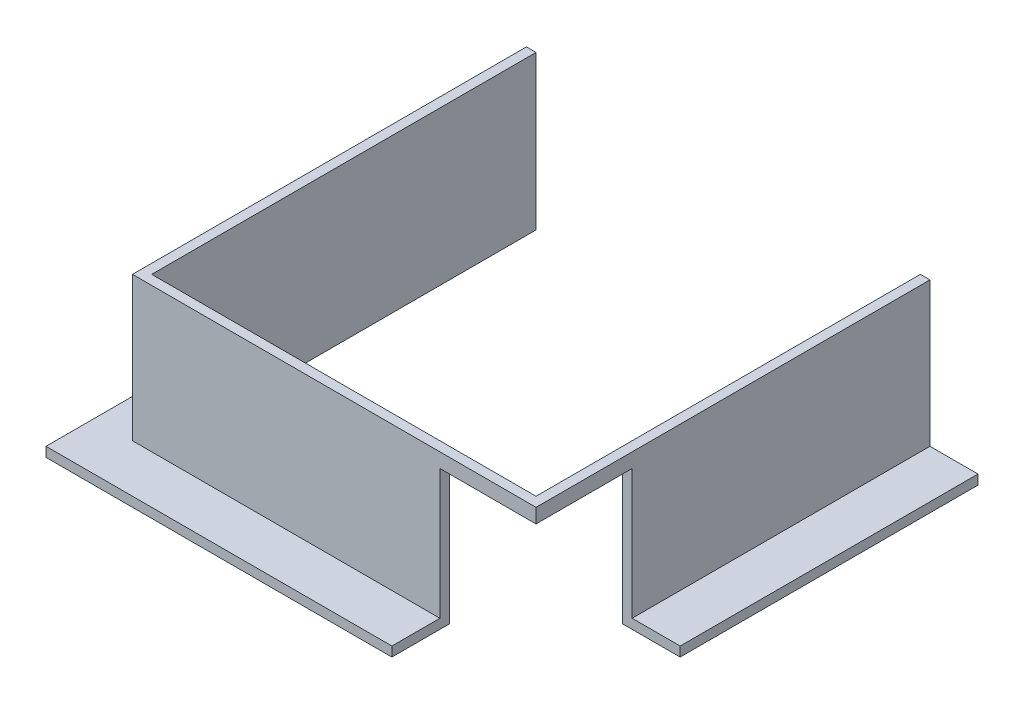
ISO-10303-21;
HEADER;
FILE_DESCRIPTION(('STEP AP214'),'2;1');
FILE_NAME('part.step','',(''),(''),'','','');
FILE_SCHEMA(('AUTOMOTIVE_DESIGN { 1 0 10303 214 1 1 1 1 }'));
ENDSEC;
DATA;
#1=APPLICATION_CONTEXT('core data for automotive mechanical design processes');
#2=APPLICATION_PROTOCOL_DEFINITION('international standard','automotive_design',2000,#1);
#3=PRODUCT_CONTEXT('',#1,'mechanical');
#4=PRODUCT('Part','Part','',(#3));
#5=PRODUCT_RELATED_PRODUCT_CATEGORY('part','',(#4));
#6=PRODUCT_DEFINITION_FORMATION('','',#4);
#7=PRODUCT_DEFINITION_CONTEXT('part definition',#1,'design');
#8=PRODUCT_DEFINITION('design','',#6,#7);
#9=PRODUCT_DEFINITION_SHAPE('','',#8);
#10=(LENGTH_UNIT() NAMED_UNIT(*) SI_UNIT(.MILLI.,.METRE.));
#11=(NAMED_UNIT(*) PLANE_ANGLE_UNIT() SI_UNIT($,.RADIAN.));
#12=(NAMED_UNIT(*) SI_UNIT($,.STERADIAN.) SOLID_ANGLE_UNIT());
#13=UNCERTAINTY_MEASURE_WITH_UNIT(LENGTH_MEASURE(1.E-05),#10,'distance_accuracy_value','');
#14=(GEOMETRIC_REPRESENTATION_CONTEXT(3) GLOBAL_UNCERTAINTY_ASSIGNED_CONTEXT((#13)) GLOBAL_UNIT_ASSIGNED_CONTEXT((#10,
#11,#12)) REPRESENTATION_CONTEXT('',''));
#15=CARTESIAN_POINT('',(0.,0.,0.));
#16=DIRECTION('',(0.,0.,1.));
#17=DIRECTION('',(1.,0.,0.));
#18=AXIS2_PLACEMENT_3D('',#15,#16,#17);
#19=CARTESIAN_POINT('',(0.,0.,0.));
#20=DIRECTION('',(0.,1.,0.));
#21=DIRECTION('',(0.,0.,1.));
#22=AXIS2_PLACEMENT_3D('',#19,#20,#21);
#23=PLANE('',#22);
#24=DIRECTION('',(1.,0.,0.));
#25=VECTOR('',#24,1.);
#26=CARTESIAN_POINT('',(62.,0.,-18.));
#27=LINE('',#26,#25);
#28=CARTESIAN_POINT('',(82.,0.,-18.));
#29=VERTEX_POINT('',#28);
#30=CARTESIAN_POINT('',(92.,0.,-18.));
#31=VERTEX_POINT('',#30);
#32=EDGE_CURVE('E189',#29,#31,#27,.T.);
#33=ORIENTED_EDGE('',*,*,#32,.T.);
#34=DIRECTION('',(0.,0.,1.));
#35=VECTOR('',#34,1.);
#36=CARTESIAN_POINT('',(92.,0.,1.99999999999999));
#37=LINE('',#36,#35);
#38=CARTESIAN_POINT('',(92.,0.,-80.));
#39=VERTEX_POINT('',#38);
#40=EDGE_CURVE('E217',#39,#31,#37,.T.);
#41=ORIENTED_EDGE('',*,*,#40,.F.);
#42=DIRECTION('',(1.,0.,0.));
#43=VECTOR('',#42,1.);
#44=CARTESIAN_POINT('',(92.,0.,-80.));
#45=LINE('',#44,#43);
#46=CARTESIAN_POINT('',(82.,0.,-80.));
#47=VERTEX_POINT('',#46);
#48=EDGE_CURVE('E193',#47,#39,#45,.T.);
#49=ORIENTED_EDGE('',*,*,#48,.F.);
#50=DIRECTION('',(0.,0.,-1.));
#51=VECTOR('',#50,1.);
#52=CARTESIAN_POINT('',(82.,0.,1.99999999999999));
#53=LINE('',#52,#51);
#54=EDGE_CURVE('E242',#29,#47,#53,.T.);
#55=ORIENTED_EDGE('',*,*,#54,.F.);
#56=EDGE_LOOP('',(#33,#41,#49,#55));
#57=FACE_BOUND('',#56,.T.);
#58=ADVANCED_FACE('F33',(#57),#23,.T.);
#59=CARTESIAN_POINT('',(0.,-2.,0.));
#60=DIRECTION('',(0.,1.,0.));
#61=DIRECTION('',(0.,0.,1.));
#62=AXIS2_PLACEMENT_3D('',#59,#60,#61);
#63=PLANE('',#62);
#64=DIRECTION('',(0.,0.,1.));
#65=VECTOR('',#64,1.);
#66=CARTESIAN_POINT('',(92.,-2.,1.99999999999999));
#67=LINE('',#66,#65);
#68=CARTESIAN_POINT('',(92.,-2.,-80.));
#69=VERTEX_POINT('',#68);
#70=CARTESIAN_POINT('',(92.,-2.,-18.));
#71=VERTEX_POINT('',#70);
#72=EDGE_CURVE('E205',#69,#71,#67,.T.);
#73=ORIENTED_EDGE('',*,*,#72,.T.);
#74=DIRECTION('',(-1.,0.,0.));
#75=VECTOR('',#74,1.);
#76=CARTESIAN_POINT('',(0.,-2.,-18.));
#77=LINE('',#76,#75);
#78=CARTESIAN_POINT('',(80.,-2.,-18.));
#79=VERTEX_POINT('',#78);
#80=EDGE_CURVE('E41',#71,#79,#77,.T.);
#81=ORIENTED_EDGE('',*,*,#80,.T.);
#82=DIRECTION('',(0.,0.,-1.));
#83=VECTOR('',#82,1.);
#84=CARTESIAN_POINT('',(80.,-2.,-80.));
#85=LINE('',#84,#83);
#86=CARTESIAN_POINT('',(80.,-2.,-80.));
#87=VERTEX_POINT('',#86);
#88=EDGE_CURVE('E201',#79,#87,#85,.T.);
#89=ORIENTED_EDGE('',*,*,#88,.T.);
#90=DIRECTION('',(1.,0.,0.));
#91=VECTOR('',#90,1.);
#92=CARTESIAN_POINT('',(92.,-2.,-80.));
#93=LINE('',#92,#91);
#94=EDGE_CURVE('E203',#87,#69,#93,.T.);
#95=ORIENTED_EDGE('',*,*,#94,.T.);
#96=EDGE_LOOP('',(#73,#81,#89,#95));
#97=FACE_BOUND('',#96,.T.);
#98=ADVANCED_FACE('F281',(#97),#63,.F.);
#99=CARTESIAN_POINT('',(0.,30.,0.));
#100=DIRECTION('',(-1.,0.,0.));
#101=DIRECTION('',(0.,0.,1.));
#102=AXIS2_PLACEMENT_3D('',#99,#100,#101);
#103=PLANE('',#102);
#104=DIRECTION('',(0.,-1.,0.));
#105=VECTOR('',#104,1.);
#106=CARTESIAN_POINT('',(0.,30.,0.));
#107=LINE('',#106,#105);
#108=CARTESIAN_POINT('',(0.,30.,0.));
#109=VERTEX_POINT('',#108);
#110=CARTESIAN_POINT('',(0.,-2.,0.));
#111=VERTEX_POINT('',#110);
#112=EDGE_CURVE('E256',#109,#111,#107,.T.);
#113=ORIENTED_EDGE('',*,*,#112,.T.);
#114=DIRECTION('',(0.,0.,1.));
#115=VECTOR('',#114,1.);
#116=CARTESIAN_POINT('',(0.,-2.,0.));
#117=LINE('',#116,#115);
#118=CARTESIAN_POINT('',(0.,-2.,-80.));
#119=VERTEX_POINT('',#118);
#120=EDGE_CURVE('E194',#119,#111,#117,.T.);
#121=ORIENTED_EDGE('',*,*,#120,.F.);
#122=DIRECTION('',(0.,-1.,0.));
#123=VECTOR('',#122,1.);
#124=CARTESIAN_POINT('',(0.,30.,-80.));
#125=LINE('',#124,#123);
#126=CARTESIAN_POINT('',(0.,30.,-80.));
#127=VERTEX_POINT('',#126);
#128=EDGE_CURVE('E278',#127,#119,#125,.T.);
#129=ORIENTED_EDGE('',*,*,#128,.F.);
#130=DIRECTION('',(0.,0.,-1.));
#131=VECTOR('',#130,1.);
#132=CARTESIAN_POINT('',(0.,30.,0.));
#133=LINE('',#132,#131);
#134=EDGE_CURVE('E238',#109,#127,#133,.T.);
#135=ORIENTED_EDGE('',*,*,#134,.F.);
#136=EDGE_LOOP('',(#113,#121,#129,#135));
#137=FACE_BOUND('',#136,.T.);
#138=ADVANCED_FACE('F35',(#137),#103,.F.);
#139=CARTESIAN_POINT('',(0.,30.,-80.));
#140=DIRECTION('',(0.,0.,1.));
#141=DIRECTION('',(1.,0.,0.));
#142=AXIS2_PLACEMENT_3D('',#139,#140,#141);
#143=PLANE('',#142);
#144=ORIENTED_EDGE('',*,*,#128,.T.);
#145=DIRECTION('',(1.,0.,0.));
#146=VECTOR('',#145,1.);
#147=CARTESIAN_POINT('',(0.,-2.,-80.));
#148=LINE('',#147,#146);
#149=CARTESIAN_POINT('',(-10.,-2.,-80.));
#150=VERTEX_POINT('',#149);
#151=EDGE_CURVE('E212',#150,#119,#148,.T.);
#152=ORIENTED_EDGE('',*,*,#151,.F.);
#153=DIRECTION('',(0.,1.,0.));
#154=VECTOR('',#153,1.);
#155=CARTESIAN_POINT('',(-10.,-2.,-80.));
#156=LINE('',#155,#154);
#157=CARTESIAN_POINT('',(-10.,0.,-80.));
#158=VERTEX_POINT('',#157);
#159=EDGE_CURVE('E215',#150,#158,#156,.T.);
#160=ORIENTED_EDGE('',*,*,#159,.T.);
#161=DIRECTION('',(1.,0.,0.));
#162=VECTOR('',#161,1.);
#163=CARTESIAN_POINT('',(0.,0.,-80.));
#164=LINE('',#163,#162);
#165=CARTESIAN_POINT('',(-2.,0.,-80.));
#166=VERTEX_POINT('',#165);
#167=EDGE_CURVE('E198',#158,#166,#164,.T.);
#168=ORIENTED_EDGE('',*,*,#167,.T.);
#169=DIRECTION('',(0.,-1.,0.));
#170=VECTOR('',#169,1.);
#171=CARTESIAN_POINT('',(-2.,30.,-80.));
#172=LINE('',#171,#170);
#173=CARTESIAN_POINT('',(-2.,30.,-80.));
#174=VERTEX_POINT('',#173);
#175=EDGE_CURVE('E275',#174,#166,#172,.T.);
#176=ORIENTED_EDGE('',*,*,#175,.F.);
#177=DIRECTION('',(-1.,0.,0.));
#178=VECTOR('',#177,1.);
#179=CARTESIAN_POINT('',(0.,30.,-80.));
#180=LINE('',#179,#178);
#181=EDGE_CURVE('E241',#127,#174,#180,.T.);
#182=ORIENTED_EDGE('',*,*,#181,.F.);
#183=EDGE_LOOP('',(#144,#152,#160,#168,#176,#182));
#184=FACE_BOUND('',#183,.T.);
#185=ADVANCED_FACE('F320',(#184),#143,.F.);
#186=CARTESIAN_POINT('',(-2.,30.,-80.));
#187=DIRECTION('',(1.,0.,0.));
#188=DIRECTION('',(0.,0.,-1.));
#189=AXIS2_PLACEMENT_3D('',#186,#187,#188);
#190=PLANE('',#189);
#191=DIRECTION('',(0.,0.,1.));
#192=VECTOR('',#191,1.);
#193=CARTESIAN_POINT('',(-2.,0.,-80.));
#194=LINE('',#193,#192);
#195=CARTESIAN_POINT('',(-2.,0.,2.));
#196=VERTEX_POINT('',#195);
#197=EDGE_CURVE('E237',#166,#196,#194,.T.);
#198=ORIENTED_EDGE('',*,*,#197,.T.);
#199=DIRECTION('',(0.,-1.,0.));
#200=VECTOR('',#199,1.);
#201=CARTESIAN_POINT('',(-2.,30.,2.));
#202=LINE('',#201,#200);
#203=CARTESIAN_POINT('',(-2.,30.,2.));
#204=VERTEX_POINT('',#203);
#205=EDGE_CURVE('E273',#204,#196,#202,.T.);
#206=ORIENTED_EDGE('',*,*,#205,.F.);
#207=DIRECTION('',(0.,0.,1.));
#208=VECTOR('',#207,1.);
#209=CARTESIAN_POINT('',(-2.,30.,-80.));
#210=LINE('',#209,#208);
#211=EDGE_CURVE('E244',#174,#204,#210,.T.);
#212=ORIENTED_EDGE('',*,*,#211,.F.);
#213=ORIENTED_EDGE('',*,*,#175,.T.);
#214=EDGE_LOOP('',(#198,#206,#212,#213));
#215=FACE_BOUND('',#214,.T.);
#216=ADVANCED_FACE('F313',(#215),#190,.F.);
#217=CARTESIAN_POINT('',(80.,30.,2.));
#218=DIRECTION('',(0.,0.,-1.));
#219=DIRECTION('',(-1.,0.,0.));
#220=AXIS2_PLACEMENT_3D('',#217,#218,#219);
#221=PLANE('',#220);
#222=DIRECTION('',(0.,-1.,0.));
#223=VECTOR('',#222,1.);
#224=CARTESIAN_POINT('',(62.,0.,1.99999999999999));
#225=LINE('',#224,#223);
#226=CARTESIAN_POINT('',(62.,27.,1.99999999999999));
#227=VERTEX_POINT('',#226);
#228=CARTESIAN_POINT('',(62.,0.,2.00000000000004));
#229=VERTEX_POINT('',#228);
#230=EDGE_CURVE('E154',#227,#229,#225,.T.);
#231=ORIENTED_EDGE('',*,*,#230,.F.);
#232=DIRECTION('',(1.,0.,0.));
#233=VECTOR('',#232,1.);
#234=CARTESIAN_POINT('',(62.,27.,1.99999999999999));
#235=LINE('',#234,#233);
#236=CARTESIAN_POINT('',(82.,27.,1.99999999999999));
#237=VERTEX_POINT('',#236);
#238=EDGE_CURVE('E159',#227,#237,#235,.T.);
#239=ORIENTED_EDGE('',*,*,#238,.T.);
#240=DIRECTION('',(0.,-1.,0.));
#241=VECTOR('',#240,1.);
#242=CARTESIAN_POINT('',(82.,30.,1.99999999999999));
#243=LINE('',#242,#241);
#244=CARTESIAN_POINT('',(82.,30.,1.99999999999999));
#245=VERTEX_POINT('',#244);
#246=EDGE_CURVE('E271',#245,#237,#243,.T.);
#247=ORIENTED_EDGE('',*,*,#246,.F.);
#248=DIRECTION('',(1.,0.,0.));
#249=VECTOR('',#248,1.);
#250=CARTESIAN_POINT('',(80.,30.,2.));
#251=LINE('',#250,#249);
#252=EDGE_CURVE('E246',#204,#245,#251,.T.);
#253=ORIENTED_EDGE('',*,*,#252,.F.);
#254=ORIENTED_EDGE('',*,*,#205,.T.);
#255=DIRECTION('',(1.,0.,0.));
#256=VECTOR('',#255,1.);
#257=CARTESIAN_POINT('',(80.,0.,2.));
#258=LINE('',#257,#256);
#259=EDGE_CURVE('E162',#196,#229,#258,.T.);
#260=ORIENTED_EDGE('',*,*,#259,.T.);
#261=EDGE_LOOP('',(#231,#239,#247,#253,#254,#260));
#262=FACE_BOUND('',#261,.T.);
#263=ADVANCED_FACE('F156',(#262),#221,.F.);
#264=CARTESIAN_POINT('',(82.,30.,1.99999999999999));
#265=DIRECTION('',(-1.,0.,0.));
#266=DIRECTION('',(0.,0.,1.));
#267=AXIS2_PLACEMENT_3D('',#264,#265,#266);
#268=PLANE('',#267);
#269=ORIENTED_EDGE('',*,*,#246,.T.);
#270=DIRECTION('',(0.,0.,1.));
#271=VECTOR('',#270,1.);
#272=CARTESIAN_POINT('',(82.,27.,-18.));
#273=LINE('',#272,#271);
#274=CARTESIAN_POINT('',(82.,27.,-18.));
#275=VERTEX_POINT('',#274);
#276=EDGE_CURVE('E171',#275,#237,#273,.T.);
#277=ORIENTED_EDGE('',*,*,#276,.F.);
#278=DIRECTION('',(0.,1.,0.));
#279=VECTOR('',#278,1.);
#280=CARTESIAN_POINT('',(82.,20.,-18.));
#281=LINE('',#280,#279);
#282=EDGE_CURVE('E164',#29,#275,#281,.T.);
#283=ORIENTED_EDGE('',*,*,#282,.F.);
#284=ORIENTED_EDGE('',*,*,#54,.T.);
#285=DIRECTION('',(0.,-1.,0.));
#286=VECTOR('',#285,1.);
#287=CARTESIAN_POINT('',(82.,30.,-80.));
#288=LINE('',#287,#286);
#289=CARTESIAN_POINT('',(82.,30.,-80.));
#290=VERTEX_POINT('',#289);
#291=EDGE_CURVE('E268',#290,#47,#288,.T.);
#292=ORIENTED_EDGE('',*,*,#291,.F.);
#293=DIRECTION('',(0.,0.,-1.));
#294=VECTOR('',#293,1.);
#295=CARTESIAN_POINT('',(82.,30.,1.99999999999999));
#296=LINE('',#295,#294);
#297=EDGE_CURVE('E248',#245,#290,#296,.T.);
#298=ORIENTED_EDGE('',*,*,#297,.F.);
#299=EDGE_LOOP('',(#269,#277,#283,#284,#292,#298));
#300=FACE_BOUND('',#299,.T.);
#301=ADVANCED_FACE('F305',(#300),#268,.F.);
#302=CARTESIAN_POINT('',(82.,30.,-80.));
#303=DIRECTION('',(0.,0.,1.));
#304=DIRECTION('',(1.,0.,0.));
#305=AXIS2_PLACEMENT_3D('',#302,#303,#304);
#306=PLANE('',#305);
#307=ORIENTED_EDGE('',*,*,#291,.T.);
#308=ORIENTED_EDGE('',*,*,#48,.T.);
#309=DIRECTION('',(0.,1.,0.));
#310=VECTOR('',#309,1.);
#311=CARTESIAN_POINT('',(92.,-2.,-80.));
#312=LINE('',#311,#310);
#313=EDGE_CURVE('E231',#69,#39,#312,.T.);
#314=ORIENTED_EDGE('',*,*,#313,.F.);
#315=ORIENTED_EDGE('',*,*,#94,.F.);
#316=DIRECTION('',(0.,-1.,0.));
#317=VECTOR('',#316,1.);
#318=CARTESIAN_POINT('',(80.,30.,-80.));
#319=LINE('',#318,#317);
#320=CARTESIAN_POINT('',(80.,30.,-80.));
#321=VERTEX_POINT('',#320);
#322=EDGE_CURVE('E265',#321,#87,#319,.T.);
#323=ORIENTED_EDGE('',*,*,#322,.F.);
#324=DIRECTION('',(-1.,0.,0.));
#325=VECTOR('',#324,1.);
#326=CARTESIAN_POINT('',(82.,30.,-80.));
#327=LINE('',#326,#325);
#328=EDGE_CURVE('E250',#290,#321,#327,.T.);
#329=ORIENTED_EDGE('',*,*,#328,.F.);
#330=EDGE_LOOP('',(#307,#308,#314,#315,#323,#329));
#331=FACE_BOUND('',#330,.T.);
#332=ADVANCED_FACE('F294',(#331),#306,.F.);
#333=CARTESIAN_POINT('',(80.,30.,0.));
#334=DIRECTION('',(1.,0.,0.));
#335=DIRECTION('',(0.,0.,-1.));
#336=AXIS2_PLACEMENT_3D('',#333,#334,#335);
#337=PLANE('',#336);
#338=DIRECTION('',(0.,1.,0.));
#339=VECTOR('',#338,1.);
#340=CARTESIAN_POINT('',(80.,30.,-18.));
#341=LINE('',#340,#339);
#342=CARTESIAN_POINT('',(80.,27.,-18.));
#343=VERTEX_POINT('',#342);
#344=EDGE_CURVE('E56',#79,#343,#341,.T.);
#345=ORIENTED_EDGE('',*,*,#344,.T.);
#346=DIRECTION('',(0.,0.,1.));
#347=VECTOR('',#346,1.);
#348=CARTESIAN_POINT('',(80.,27.,0.));
#349=LINE('',#348,#347);
#350=CARTESIAN_POINT('',(80.,27.,0.));
#351=VERTEX_POINT('',#350);
#352=EDGE_CURVE('E176',#343,#351,#349,.T.);
#353=ORIENTED_EDGE('',*,*,#352,.T.);
#354=DIRECTION('',(0.,-1.,0.));
#355=VECTOR('',#354,1.);
#356=CARTESIAN_POINT('',(80.,30.,0.));
#357=LINE('',#356,#355);
#358=CARTESIAN_POINT('',(80.,30.,0.));
#359=VERTEX_POINT('',#358);
#360=EDGE_CURVE('E262',#359,#351,#357,.T.);
#361=ORIENTED_EDGE('',*,*,#360,.F.);
#362=DIRECTION('',(0.,0.,1.));
#363=VECTOR('',#362,1.);
#364=CARTESIAN_POINT('',(80.,30.,0.));
#365=LINE('',#364,#363);
#366=EDGE_CURVE('E252',#321,#359,#365,.T.);
#367=ORIENTED_EDGE('',*,*,#366,.F.);
#368=ORIENTED_EDGE('',*,*,#322,.T.);
#369=ORIENTED_EDGE('',*,*,#88,.F.);
#370=EDGE_LOOP('',(#345,#353,#361,#367,#368,#369));
#371=FACE_BOUND('',#370,.T.);
#372=ADVANCED_FACE('F285',(#371),#337,.F.);
#373=CARTESIAN_POINT('',(0.,30.,0.));
#374=DIRECTION('',(0.,0.,1.));
#375=DIRECTION('',(1.,0.,0.));
#376=AXIS2_PLACEMENT_3D('',#373,#374,#375);
#377=PLANE('',#376);
#378=ORIENTED_EDGE('',*,*,#360,.T.);
#379=DIRECTION('',(-1.,0.,0.));
#380=VECTOR('',#379,1.);
#381=CARTESIAN_POINT('',(0.,27.,0.));
#382=LINE('',#381,#380);
#383=CARTESIAN_POINT('',(62.,27.,0.));
#384=VERTEX_POINT('',#383);
#385=EDGE_CURVE('E11',#351,#384,#382,.T.);
#386=ORIENTED_EDGE('',*,*,#385,.T.);
#387=DIRECTION('',(0.,-1.,0.));
#388=VECTOR('',#387,1.);
#389=CARTESIAN_POINT('',(62.,30.,0.));
#390=LINE('',#389,#388);
#391=CARTESIAN_POINT('',(62.,-2.,0.));
#392=VERTEX_POINT('',#391);
#393=EDGE_CURVE('E163',#384,#392,#390,.T.);
#394=ORIENTED_EDGE('',*,*,#393,.T.);
#395=DIRECTION('',(1.,0.,0.));
#396=VECTOR('',#395,1.);
#397=CARTESIAN_POINT('',(80.,-2.,0.));
#398=LINE('',#397,#396);
#399=EDGE_CURVE('E197',#111,#392,#398,.T.);
#400=ORIENTED_EDGE('',*,*,#399,.F.);
#401=ORIENTED_EDGE('',*,*,#112,.F.);
#402=DIRECTION('',(-1.,0.,0.));
#403=VECTOR('',#402,1.);
#404=CARTESIAN_POINT('',(0.,30.,0.));
#405=LINE('',#404,#403);
#406=EDGE_CURVE('E254',#359,#109,#405,.T.);
#407=ORIENTED_EDGE('',*,*,#406,.F.);
#408=EDGE_LOOP('',(#378,#386,#394,#400,#401,#407));
#409=FACE_BOUND('',#408,.T.);
#410=ADVANCED_FACE('F337',(#409),#377,.F.);
#411=CARTESIAN_POINT('',(0.,30.,0.));
#412=DIRECTION('',(0.,1.,0.));
#413=DIRECTION('',(0.,0.,1.));
#414=AXIS2_PLACEMENT_3D('',#411,#412,#413);
#415=PLANE('',#414);
#416=ORIENTED_EDGE('',*,*,#134,.T.);
#417=ORIENTED_EDGE('',*,*,#181,.T.);
#418=ORIENTED_EDGE('',*,*,#211,.T.);
#419=ORIENTED_EDGE('',*,*,#252,.T.);
#420=ORIENTED_EDGE('',*,*,#297,.T.);
#421=ORIENTED_EDGE('',*,*,#328,.T.);
#422=ORIENTED_EDGE('',*,*,#366,.T.);
#423=ORIENTED_EDGE('',*,*,#406,.T.);
#424=EDGE_LOOP('',(#416,#417,#418,#419,#420,#421,#422,#423));
#425=FACE_BOUND('',#424,.T.);
#426=ADVANCED_FACE('F308',(#425),#415,.T.);
#427=CARTESIAN_POINT('',(62.,20.,-18.));
#428=DIRECTION('',(0.,0.,-1.));
#429=DIRECTION('',(-1.,0.,0.));
#430=AXIS2_PLACEMENT_3D('',#427,#428,#429);
#431=PLANE('',#430);
#432=ORIENTED_EDGE('',*,*,#344,.F.);
#433=ORIENTED_EDGE('',*,*,#80,.F.);
#434=DIRECTION('',(0.,1.,0.));
#435=VECTOR('',#434,1.);
#436=CARTESIAN_POINT('',(92.,0.,-18.));
#437=LINE('',#436,#435);
#438=EDGE_CURVE('E179',#71,#31,#437,.T.);
#439=ORIENTED_EDGE('',*,*,#438,.T.);
#440=ORIENTED_EDGE('',*,*,#32,.F.);
#441=ORIENTED_EDGE('',*,*,#282,.T.);
#442=DIRECTION('',(1.,0.,0.));
#443=VECTOR('',#442,1.);
#444=CARTESIAN_POINT('',(62.,27.,-18.));
#445=LINE('',#444,#443);
#446=EDGE_CURVE('E170',#343,#275,#445,.T.);
#447=ORIENTED_EDGE('',*,*,#446,.F.);
#448=EDGE_LOOP('',(#432,#433,#439,#440,#441,#447));
#449=FACE_BOUND('',#448,.T.);
#450=ADVANCED_FACE('F299',(#449),#431,.F.);
#451=CARTESIAN_POINT('',(62.,0.,0.));
#452=DIRECTION('',(-1.,0.,0.));
#453=DIRECTION('',(0.,0.,1.));
#454=AXIS2_PLACEMENT_3D('',#451,#452,#453);
#455=PLANE('',#454);
#456=ORIENTED_EDGE('',*,*,#393,.F.);
#457=DIRECTION('',(0.,0.,1.));
#458=VECTOR('',#457,1.);
#459=CARTESIAN_POINT('',(62.,27.,-18.));
#460=LINE('',#459,#458);
#461=EDGE_CURVE('E167',#384,#227,#460,.T.);
#462=ORIENTED_EDGE('',*,*,#461,.T.);
#463=ORIENTED_EDGE('',*,*,#230,.T.);
#464=DIRECTION('',(0.,0.,1.));
#465=VECTOR('',#464,1.);
#466=CARTESIAN_POINT('',(62.,0.,12.));
#467=LINE('',#466,#465);
#468=CARTESIAN_POINT('',(62.,0.,12.));
#469=VERTEX_POINT('',#468);
#470=EDGE_CURVE('E184',#229,#469,#467,.T.);
#471=ORIENTED_EDGE('',*,*,#470,.T.);
#472=DIRECTION('',(0.,-1.,0.));
#473=VECTOR('',#472,1.);
#474=CARTESIAN_POINT('',(62.,-2.,12.));
#475=LINE('',#474,#473);
#476=CARTESIAN_POINT('',(62.,-2.,12.));
#477=VERTEX_POINT('',#476);
#478=EDGE_CURVE('E48',#469,#477,#475,.T.);
#479=ORIENTED_EDGE('',*,*,#478,.T.);
#480=DIRECTION('',(0.,0.,-1.));
#481=VECTOR('',#480,1.);
#482=CARTESIAN_POINT('',(62.,-2.,-18.));
#483=LINE('',#482,#481);
#484=EDGE_CURVE('E187',#477,#392,#483,.T.);
#485=ORIENTED_EDGE('',*,*,#484,.T.);
#486=EDGE_LOOP('',(#456,#462,#463,#471,#479,#485));
#487=FACE_BOUND('',#486,.T.);
#488=ADVANCED_FACE('F168',(#487),#455,.F.);
#489=ORIENTED_EDGE('',*,*,#470,.F.);
#490=ORIENTED_EDGE('',*,*,#259,.F.);
#491=ORIENTED_EDGE('',*,*,#197,.F.);
#492=ORIENTED_EDGE('',*,*,#167,.F.);
#493=DIRECTION('',(0.,0.,-1.));
#494=VECTOR('',#493,1.);
#495=CARTESIAN_POINT('',(-10.,0.,-80.));
#496=LINE('',#495,#494);
#497=CARTESIAN_POINT('',(-10.,0.,12.));
#498=VERTEX_POINT('',#497);
#499=EDGE_CURVE('E222',#498,#158,#496,.T.);
#500=ORIENTED_EDGE('',*,*,#499,.F.);
#501=DIRECTION('',(-1.,0.,0.));
#502=VECTOR('',#501,1.);
#503=CARTESIAN_POINT('',(-10.,0.,12.));
#504=LINE('',#503,#502);
#505=EDGE_CURVE('E220',#469,#498,#504,.T.);
#506=ORIENTED_EDGE('',*,*,#505,.F.);
#507=EDGE_LOOP('',(#489,#490,#491,#492,#500,#506));
#508=FACE_BOUND('',#507,.T.);
#509=ADVANCED_FACE('F317',(#508),#23,.T.);
#510=CARTESIAN_POINT('',(92.,-2.,1.99999999999999));
#511=DIRECTION('',(-1.,0.,0.));
#512=DIRECTION('',(0.,0.,1.));
#513=AXIS2_PLACEMENT_3D('',#510,#511,#512);
#514=PLANE('',#513);
#515=ORIENTED_EDGE('',*,*,#40,.T.);
#516=ORIENTED_EDGE('',*,*,#438,.F.);
#517=ORIENTED_EDGE('',*,*,#72,.F.);
#518=ORIENTED_EDGE('',*,*,#313,.T.);
#519=EDGE_LOOP('',(#515,#516,#517,#518));
#520=FACE_BOUND('',#519,.T.);
#521=ADVANCED_FACE('F298',(#520),#514,.F.);
#522=CARTESIAN_POINT('',(-10.,-2.,12.));
#523=DIRECTION('',(0.,0.,-1.));
#524=DIRECTION('',(-1.,0.,0.));
#525=AXIS2_PLACEMENT_3D('',#522,#523,#524);
#526=PLANE('',#525);
#527=DIRECTION('',(-1.,0.,0.));
#528=VECTOR('',#527,1.);
#529=CARTESIAN_POINT('',(-10.,-2.,12.));
#530=LINE('',#529,#528);
#531=CARTESIAN_POINT('',(-10.,-2.,12.));
#532=VERTEX_POINT('',#531);
#533=EDGE_CURVE('E208',#477,#532,#530,.T.);
#534=ORIENTED_EDGE('',*,*,#533,.F.);
#535=ORIENTED_EDGE('',*,*,#478,.F.);
#536=ORIENTED_EDGE('',*,*,#505,.T.);
#537=DIRECTION('',(0.,1.,0.));
#538=VECTOR('',#537,1.);
#539=CARTESIAN_POINT('',(-10.,-2.,12.));
#540=LINE('',#539,#538);
#541=EDGE_CURVE('E228',#532,#498,#540,.T.);
#542=ORIENTED_EDGE('',*,*,#541,.F.);
#543=EDGE_LOOP('',(#534,#535,#536,#542));
#544=FACE_BOUND('',#543,.T.);
#545=ADVANCED_FACE('F330',(#544),#526,.F.);
#546=CARTESIAN_POINT('',(-10.,-2.,-80.));
#547=DIRECTION('',(1.,0.,0.));
#548=DIRECTION('',(0.,0.,-1.));
#549=AXIS2_PLACEMENT_3D('',#546,#547,#548);
#550=PLANE('',#549);
#551=ORIENTED_EDGE('',*,*,#499,.T.);
#552=ORIENTED_EDGE('',*,*,#159,.F.);
#553=DIRECTION('',(0.,0.,-1.));
#554=VECTOR('',#553,1.);
#555=CARTESIAN_POINT('',(-10.,-2.,7.4129425823151));
#556=LINE('',#555,#554);
#557=EDGE_CURVE('E210',#532,#150,#556,.T.);
#558=ORIENTED_EDGE('',*,*,#557,.F.);
#559=ORIENTED_EDGE('',*,*,#541,.T.);
#560=EDGE_LOOP('',(#551,#552,#558,#559));
#561=FACE_BOUND('',#560,.T.);
#562=ADVANCED_FACE('F325',(#561),#550,.F.);
#563=ORIENTED_EDGE('',*,*,#399,.T.);
#564=ORIENTED_EDGE('',*,*,#484,.F.);
#565=ORIENTED_EDGE('',*,*,#533,.T.);
#566=ORIENTED_EDGE('',*,*,#557,.T.);
#567=ORIENTED_EDGE('',*,*,#151,.T.);
#568=ORIENTED_EDGE('',*,*,#120,.T.);
#569=EDGE_LOOP('',(#563,#564,#565,#566,#567,#568));
#570=FACE_BOUND('',#569,.T.);
#571=ADVANCED_FACE('F332',(#570),#63,.F.);
#572=CARTESIAN_POINT('',(62.,27.,-18.));
#573=DIRECTION('',(0.,1.,0.));
#574=DIRECTION('',(0.,0.,1.));
#575=AXIS2_PLACEMENT_3D('',#572,#573,#574);
#576=PLANE('',#575);
#577=ORIENTED_EDGE('',*,*,#446,.T.);
#578=ORIENTED_EDGE('',*,*,#276,.T.);
#579=ORIENTED_EDGE('',*,*,#238,.F.);
#580=ORIENTED_EDGE('',*,*,#461,.F.);
#581=ORIENTED_EDGE('',*,*,#385,.F.);
#582=ORIENTED_EDGE('',*,*,#352,.F.);
#583=EDGE_LOOP('',(#577,#578,#579,#580,#581,#582));
#584=FACE_BOUND('',#583,.T.);
#585=ADVANCED_FACE('F174',(#584),#576,.F.);
#586=CLOSED_SHELL('',(#58,#98,#138,#185,#216,#263,#301,#332,#372,#410,#426,#450,#488,#509,#521,
#545,#562,#571,#585));
#587=MANIFOLD_SOLID_BREP('B2',#586);
#588=ADVANCED_BREP_SHAPE_REPRESENTATION('',(#18,#587),#14);
#589=SHAPE_DEFINITION_REPRESENTATION(#9,#588);
ENDSEC;
END-ISO-10303-21;
